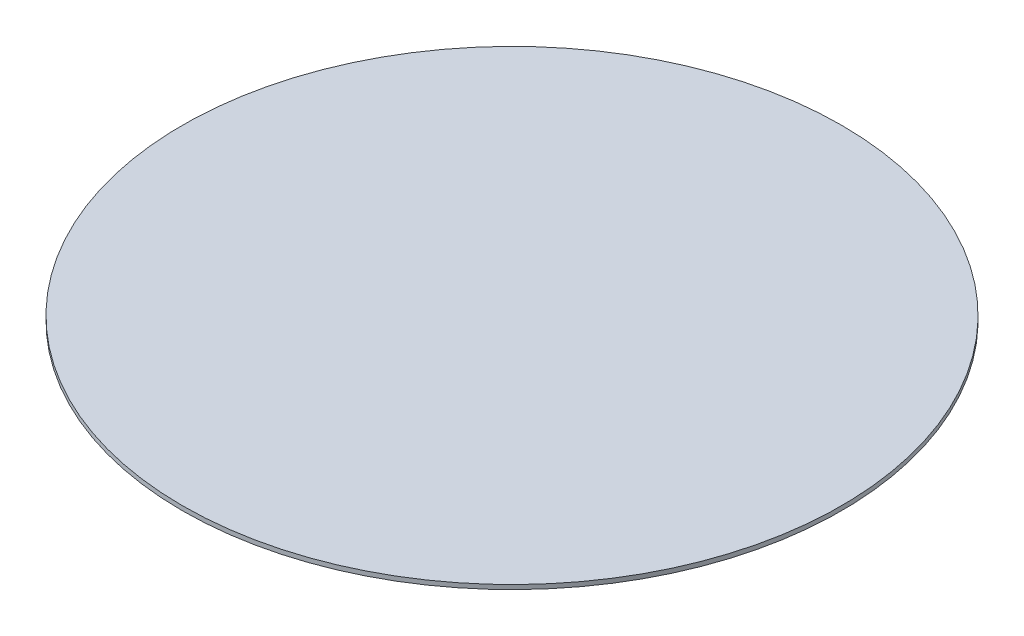
ISO-10303-21;
HEADER;
FILE_DESCRIPTION(('STEP AP214'),'2;1');
FILE_NAME('part.step','',(''),(''),'','','');
FILE_SCHEMA(('AUTOMOTIVE_DESIGN { 1 0 10303 214 1 1 1 1 }'));
ENDSEC;
DATA;
#1=APPLICATION_CONTEXT('core data for automotive mechanical design processes');
#2=APPLICATION_PROTOCOL_DEFINITION('international standard','automotive_design',2000,#1);
#3=PRODUCT_CONTEXT('',#1,'mechanical');
#4=PRODUCT('Part','Part','',(#3));
#5=PRODUCT_RELATED_PRODUCT_CATEGORY('part','',(#4));
#6=PRODUCT_DEFINITION_FORMATION('','',#4);
#7=PRODUCT_DEFINITION_CONTEXT('part definition',#1,'design');
#8=PRODUCT_DEFINITION('design','',#6,#7);
#9=PRODUCT_DEFINITION_SHAPE('','',#8);
#10=(LENGTH_UNIT() NAMED_UNIT(*) SI_UNIT(.MILLI.,.METRE.));
#11=(NAMED_UNIT(*) PLANE_ANGLE_UNIT() SI_UNIT($,.RADIAN.));
#12=(NAMED_UNIT(*) SI_UNIT($,.STERADIAN.) SOLID_ANGLE_UNIT());
#13=UNCERTAINTY_MEASURE_WITH_UNIT(LENGTH_MEASURE(1.E-05),#10,'distance_accuracy_value','');
#14=(GEOMETRIC_REPRESENTATION_CONTEXT(3) GLOBAL_UNCERTAINTY_ASSIGNED_CONTEXT((#13)) GLOBAL_UNIT_ASSIGNED_CONTEXT((#10,
#11,#12)) REPRESENTATION_CONTEXT('',''));
#15=CARTESIAN_POINT('',(0.,0.,0.));
#16=DIRECTION('',(0.,0.,1.));
#17=DIRECTION('',(1.,0.,0.));
#18=AXIS2_PLACEMENT_3D('',#15,#16,#17);
#19=CARTESIAN_POINT('',(0.,0.127,0.));
#20=DIRECTION('',(0.,-1.,0.));
#21=DIRECTION('',(0.,0.,-1.));
#22=AXIS2_PLACEMENT_3D('',#19,#20,#21);
#23=CYLINDRICAL_SURFACE('',#22,19.05);
#24=CARTESIAN_POINT('',(0.,0.127,0.));
#25=DIRECTION('',(0.,1.,0.));
#26=DIRECTION('',(0.,0.,1.));
#27=AXIS2_PLACEMENT_3D('',#24,#25,#26);
#28=CIRCLE('',#27,19.05);
#29=CARTESIAN_POINT('',(0.,0.127,19.05));
#30=VERTEX_POINT('',#29);
#31=EDGE_CURVE('E10',#30,#30,#28,.T.);
#32=ORIENTED_EDGE('',*,*,#31,.F.);
#33=EDGE_LOOP('',(#32));
#34=FACE_BOUND('',#33,.T.);
#35=CARTESIAN_POINT('',(0.,-0.127,0.));
#36=DIRECTION('',(0.,1.,0.));
#37=DIRECTION('',(0.,0.,1.));
#38=AXIS2_PLACEMENT_3D('',#35,#36,#37);
#39=CIRCLE('',#38,19.05);
#40=CARTESIAN_POINT('',(0.,-0.127,19.05));
#41=VERTEX_POINT('',#40);
#42=EDGE_CURVE('E37',#41,#41,#39,.T.);
#43=ORIENTED_EDGE('',*,*,#42,.T.);
#44=EDGE_LOOP('',(#43));
#45=FACE_BOUND('',#44,.T.);
#46=ADVANCED_FACE('F34',(#34,#45),#23,.T.);
#47=CARTESIAN_POINT('',(0.,0.127,0.));
#48=DIRECTION('',(0.,1.,0.));
#49=DIRECTION('',(0.,0.,1.));
#50=AXIS2_PLACEMENT_3D('',#47,#48,#49);
#51=PLANE('',#50);
#52=ORIENTED_EDGE('',*,*,#31,.T.);
#53=EDGE_LOOP('',(#52));
#54=FACE_BOUND('',#53,.T.);
#55=ADVANCED_FACE('F49',(#54),#51,.T.);
#56=CARTESIAN_POINT('',(0.,-0.127,0.));
#57=DIRECTION('',(0.,1.,0.));
#58=DIRECTION('',(0.,0.,1.));
#59=AXIS2_PLACEMENT_3D('',#56,#57,#58);
#60=PLANE('',#59);
#61=ORIENTED_EDGE('',*,*,#42,.F.);
#62=EDGE_LOOP('',(#61));
#63=FACE_BOUND('',#62,.T.);
#64=ADVANCED_FACE('F47',(#63),#60,.F.);
#65=CLOSED_SHELL('',(#46,#55,#64));
#66=MANIFOLD_SOLID_BREP('B2',#65);
#67=ADVANCED_BREP_SHAPE_REPRESENTATION('',(#18,#66),#14);
#68=SHAPE_DEFINITION_REPRESENTATION(#9,#67);
ENDSEC;
END-ISO-10303-21;
